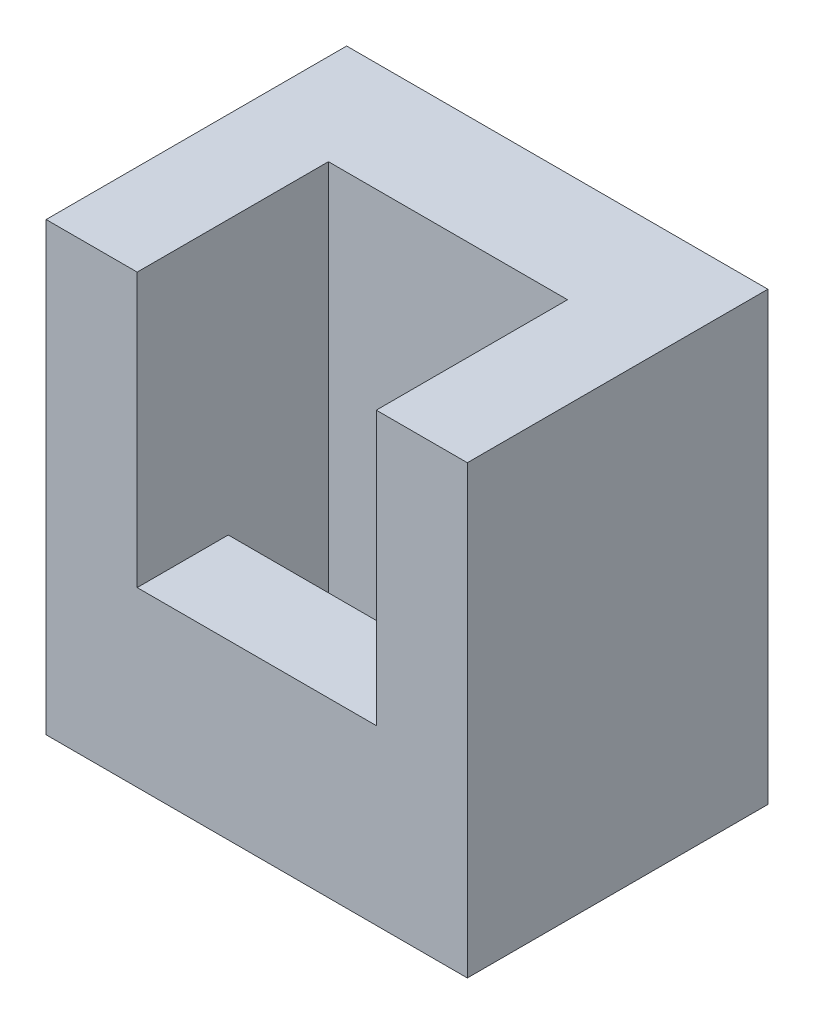
ISO-10303-21;
HEADER;
FILE_DESCRIPTION(('STEP AP214'),'2;1');
FILE_NAME('part.step','',(''),(''),'','','');
FILE_SCHEMA(('AUTOMOTIVE_DESIGN { 1 0 10303 214 1 1 1 1 }'));
ENDSEC;
DATA;
#1=APPLICATION_CONTEXT('core data for automotive mechanical design processes');
#2=APPLICATION_PROTOCOL_DEFINITION('international standard','automotive_design',2000,#1);
#3=PRODUCT_CONTEXT('',#1,'mechanical');
#4=PRODUCT('Part','Part','',(#3));
#5=PRODUCT_RELATED_PRODUCT_CATEGORY('part','',(#4));
#6=PRODUCT_DEFINITION_FORMATION('','',#4);
#7=PRODUCT_DEFINITION_CONTEXT('part definition',#1,'design');
#8=PRODUCT_DEFINITION('design','',#6,#7);
#9=PRODUCT_DEFINITION_SHAPE('','',#8);
#10=(LENGTH_UNIT() NAMED_UNIT(*) SI_UNIT(.MILLI.,.METRE.));
#11=(NAMED_UNIT(*) PLANE_ANGLE_UNIT() SI_UNIT($,.RADIAN.));
#12=(NAMED_UNIT(*) SI_UNIT($,.STERADIAN.) SOLID_ANGLE_UNIT());
#13=UNCERTAINTY_MEASURE_WITH_UNIT(LENGTH_MEASURE(1.E-05),#10,'distance_accuracy_value','');
#14=(GEOMETRIC_REPRESENTATION_CONTEXT(3) GLOBAL_UNCERTAINTY_ASSIGNED_CONTEXT((#13)) GLOBAL_UNIT_ASSIGNED_CONTEXT((#10,
#11,#12)) REPRESENTATION_CONTEXT('',''));
#15=CARTESIAN_POINT('',(0.,0.,0.));
#16=DIRECTION('',(0.,0.,1.));
#17=DIRECTION('',(1.,0.,0.));
#18=AXIS2_PLACEMENT_3D('',#15,#16,#17);
#19=CARTESIAN_POINT('',(0.,24.5,6.14769595053503));
#20=DIRECTION('',(0.,0.,-1.));
#21=DIRECTION('',(-1.,0.,0.));
#22=AXIS2_PLACEMENT_3D('',#19,#20,#21);
#23=PLANE('',#22);
#24=DIRECTION('',(0.,-1.,0.));
#25=VECTOR('',#24,1.);
#26=CARTESIAN_POINT('',(-8.02597166077041,24.5,6.14769595053503));
#27=LINE('',#26,#25);
#28=CARTESIAN_POINT('',(-8.02597166077041,9.5,6.14769595053503));
#29=VERTEX_POINT('',#28);
#30=CARTESIAN_POINT('',(-8.02597166077041,0.,6.14769595053503));
#31=VERTEX_POINT('',#30);
#32=EDGE_CURVE('E333',#29,#31,#27,.T.);
#33=ORIENTED_EDGE('',*,*,#32,.F.);
#34=DIRECTION('',(-1.,0.,0.));
#35=VECTOR('',#34,1.);
#36=CARTESIAN_POINT('',(-8.02597166077041,9.5,6.14769595053503));
#37=LINE('',#36,#35);
#38=CARTESIAN_POINT('',(5.10102833922959,9.5,6.14769595053503));
#39=VERTEX_POINT('',#38);
#40=EDGE_CURVE('E203',#39,#29,#37,.T.);
#41=ORIENTED_EDGE('',*,*,#40,.F.);
#42=DIRECTION('',(0.,-1.,0.));
#43=VECTOR('',#42,1.);
#44=CARTESIAN_POINT('',(5.10102833922959,24.5,6.14769595053503));
#45=LINE('',#44,#43);
#46=CARTESIAN_POINT('',(5.10102833922959,0.,6.14769595053503));
#47=VERTEX_POINT('',#46);
#48=EDGE_CURVE('E96',#39,#47,#45,.T.);
#49=ORIENTED_EDGE('',*,*,#48,.T.);
#50=DIRECTION('',(1.,0.,0.));
#51=VECTOR('',#50,1.);
#52=CARTESIAN_POINT('',(0.,0.,6.14769595053503));
#53=LINE('',#52,#51);
#54=EDGE_CURVE('E300',#31,#47,#53,.T.);
#55=ORIENTED_EDGE('',*,*,#54,.F.);
#56=EDGE_LOOP('',(#33,#41,#49,#55));
#57=FACE_BOUND('',#56,.T.);
#58=ADVANCED_FACE('F87',(#57),#23,.T.);
#59=CARTESIAN_POINT('',(5.10102833922959,24.5,0.));
#60=DIRECTION('',(1.,0.,0.));
#61=DIRECTION('',(0.,0.,-1.));
#62=AXIS2_PLACEMENT_3D('',#59,#60,#61);
#63=PLANE('',#62);
#64=DIRECTION('',(0.,0.,1.));
#65=VECTOR('',#64,1.);
#66=CARTESIAN_POINT('',(5.10102833922959,0.,0.));
#67=LINE('',#66,#65);
#68=CARTESIAN_POINT('',(5.10102833922959,0.,0.647695950535029));
#69=VERTEX_POINT('',#68);
#70=EDGE_CURVE('E252',#69,#47,#67,.T.);
#71=ORIENTED_EDGE('',*,*,#70,.T.);
#72=ORIENTED_EDGE('',*,*,#48,.F.);
#73=DIRECTION('',(0.,0.,-1.));
#74=VECTOR('',#73,1.);
#75=CARTESIAN_POINT('',(5.10102833922959,9.5,6.14769595053503));
#76=LINE('',#75,#74);
#77=CARTESIAN_POINT('',(5.1010283392296,9.5,11.147695950535));
#78=VERTEX_POINT('',#77);
#79=EDGE_CURVE('E217',#78,#39,#76,.T.);
#80=ORIENTED_EDGE('',*,*,#79,.F.);
#81=DIRECTION('',(0.,1.,0.));
#82=VECTOR('',#81,1.);
#83=CARTESIAN_POINT('',(5.1010283392296,9.5,11.147695950535));
#84=LINE('',#83,#82);
#85=CARTESIAN_POINT('',(5.1010283392296,24.5,11.147695950535));
#86=VERTEX_POINT('',#85);
#87=EDGE_CURVE('E202',#78,#86,#84,.T.);
#88=ORIENTED_EDGE('',*,*,#87,.T.);
#89=DIRECTION('',(0.,0.,1.));
#90=VECTOR('',#89,1.);
#91=CARTESIAN_POINT('',(5.10102833922959,24.5,0.));
#92=LINE('',#91,#90);
#93=CARTESIAN_POINT('',(5.10102833922959,24.5,0.647695950535029));
#94=VERTEX_POINT('',#93);
#95=EDGE_CURVE('E103',#94,#86,#92,.T.);
#96=ORIENTED_EDGE('',*,*,#95,.F.);
#97=DIRECTION('',(0.,-1.,0.));
#98=VECTOR('',#97,1.);
#99=CARTESIAN_POINT('',(5.10102833922959,24.5,0.647695950535029));
#100=LINE('',#99,#98);
#101=EDGE_CURVE('E12',#94,#69,#100,.T.);
#102=ORIENTED_EDGE('',*,*,#101,.T.);
#103=EDGE_LOOP('',(#71,#72,#80,#88,#96,#102));
#104=FACE_BOUND('',#103,.T.);
#105=ADVANCED_FACE('F89',(#104),#63,.F.);
#106=CARTESIAN_POINT('',(-8.02597166077041,24.5,0.));
#107=DIRECTION('',(1.,0.,0.));
#108=DIRECTION('',(0.,0.,-1.));
#109=AXIS2_PLACEMENT_3D('',#106,#107,#108);
#110=PLANE('',#109);
#111=DIRECTION('',(0.,0.,1.));
#112=VECTOR('',#111,1.);
#113=CARTESIAN_POINT('',(-8.02597166077041,0.,0.));
#114=LINE('',#113,#112);
#115=CARTESIAN_POINT('',(-8.02597166077041,0.,0.647695950535029));
#116=VERTEX_POINT('',#115);
#117=EDGE_CURVE('E304',#116,#31,#114,.T.);
#118=ORIENTED_EDGE('',*,*,#117,.F.);
#119=DIRECTION('',(0.,-1.,0.));
#120=VECTOR('',#119,1.);
#121=CARTESIAN_POINT('',(-8.02597166077041,24.5,0.647695950535029));
#122=LINE('',#121,#120);
#123=CARTESIAN_POINT('',(-8.02597166077041,24.5,0.647695950535029));
#124=VERTEX_POINT('',#123);
#125=EDGE_CURVE('E330',#124,#116,#122,.T.);
#126=ORIENTED_EDGE('',*,*,#125,.F.);
#127=DIRECTION('',(0.,0.,1.));
#128=VECTOR('',#127,1.);
#129=CARTESIAN_POINT('',(-8.02597166077041,24.5,0.));
#130=LINE('',#129,#128);
#131=CARTESIAN_POINT('',(-8.02597166077041,24.5,11.147695950535));
#132=VERTEX_POINT('',#131);
#133=EDGE_CURVE('E196',#124,#132,#130,.T.);
#134=ORIENTED_EDGE('',*,*,#133,.T.);
#135=DIRECTION('',(0.,1.,0.));
#136=VECTOR('',#135,1.);
#137=CARTESIAN_POINT('',(-8.02597166077041,9.5,11.147695950535));
#138=LINE('',#137,#136);
#139=CARTESIAN_POINT('',(-8.02597166077041,9.5,11.147695950535));
#140=VERTEX_POINT('',#139);
#141=EDGE_CURVE('E188',#140,#132,#138,.T.);
#142=ORIENTED_EDGE('',*,*,#141,.F.);
#143=DIRECTION('',(0.,0.,1.));
#144=VECTOR('',#143,1.);
#145=CARTESIAN_POINT('',(-8.02597166077041,9.5,6.14769595053503));
#146=LINE('',#145,#144);
#147=EDGE_CURVE('E192',#29,#140,#146,.T.);
#148=ORIENTED_EDGE('',*,*,#147,.F.);
#149=ORIENTED_EDGE('',*,*,#32,.T.);
#150=EDGE_LOOP('',(#118,#126,#134,#142,#148,#149));
#151=FACE_BOUND('',#150,.T.);
#152=ADVANCED_FACE('F191',(#151),#110,.T.);
#153=CARTESIAN_POINT('',(0.,24.5,0.647695950535029));
#154=DIRECTION('',(0.,0.,-1.));
#155=DIRECTION('',(-1.,0.,0.));
#156=AXIS2_PLACEMENT_3D('',#153,#154,#155);
#157=PLANE('',#156);
#158=DIRECTION('',(1.,0.,0.));
#159=VECTOR('',#158,1.);
#160=CARTESIAN_POINT('',(0.,0.,0.647695950535029));
#161=LINE('',#160,#159);
#162=CARTESIAN_POINT('',(-2.73747166077041,0.,0.647695950535029));
#163=VERTEX_POINT('',#162);
#164=EDGE_CURVE('E292',#116,#163,#161,.T.);
#165=ORIENTED_EDGE('',*,*,#164,.T.);
#166=DIRECTION('',(0.,-1.,0.));
#167=VECTOR('',#166,1.);
#168=CARTESIAN_POINT('',(-2.73747166077041,2.,0.647695950535029));
#169=LINE('',#168,#167);
#170=CARTESIAN_POINT('',(-2.73747166077041,2.,0.647695950535029));
#171=VERTEX_POINT('',#170);
#172=EDGE_CURVE('E249',#171,#163,#169,.T.);
#173=ORIENTED_EDGE('',*,*,#172,.F.);
#174=DIRECTION('',(-1.,0.,0.));
#175=VECTOR('',#174,1.);
#176=CARTESIAN_POINT('',(-2.73747166077041,2.,0.647695950535029));
#177=LINE('',#176,#175);
#178=CARTESIAN_POINT('',(-0.187471660770406,2.,0.647695950535029));
#179=VERTEX_POINT('',#178);
#180=EDGE_CURVE('E240',#179,#171,#177,.T.);
#181=ORIENTED_EDGE('',*,*,#180,.F.);
#182=DIRECTION('',(0.,-1.,0.));
#183=VECTOR('',#182,1.);
#184=CARTESIAN_POINT('',(-0.187471660770406,2.,0.647695950535029));
#185=LINE('',#184,#183);
#186=CARTESIAN_POINT('',(-0.187471660770406,0.,0.647695950535029));
#187=VERTEX_POINT('',#186);
#188=EDGE_CURVE('E253',#179,#187,#185,.T.);
#189=ORIENTED_EDGE('',*,*,#188,.T.);
#190=EDGE_CURVE('E296',#187,#69,#161,.T.);
#191=ORIENTED_EDGE('',*,*,#190,.T.);
#192=ORIENTED_EDGE('',*,*,#101,.F.);
#193=DIRECTION('',(1.,0.,0.));
#194=VECTOR('',#193,1.);
#195=CARTESIAN_POINT('',(0.,24.5,0.647695950535029));
#196=LINE('',#195,#194);
#197=EDGE_CURVE('E266',#124,#94,#196,.T.);
#198=ORIENTED_EDGE('',*,*,#197,.F.);
#199=ORIENTED_EDGE('',*,*,#125,.T.);
#200=EDGE_LOOP('',(#165,#173,#181,#189,#191,#192,#198,#199));
#201=FACE_BOUND('',#200,.T.);
#202=ADVANCED_FACE('F364',(#201),#157,.F.);
#203=CARTESIAN_POINT('',(0.,24.5,-5.35230404946497));
#204=DIRECTION('',(0.,0.,-1.));
#205=DIRECTION('',(-1.,0.,0.));
#206=AXIS2_PLACEMENT_3D('',#203,#204,#205);
#207=PLANE('',#206);
#208=DIRECTION('',(0.,-1.,0.));
#209=VECTOR('',#208,1.);
#210=CARTESIAN_POINT('',(-2.73747166077041,2.,-5.35230404946497));
#211=LINE('',#210,#209);
#212=CARTESIAN_POINT('',(-2.73747166077041,2.,-5.35230404946497));
#213=VERTEX_POINT('',#212);
#214=CARTESIAN_POINT('',(-2.73747166077041,0.,-5.35230404946497));
#215=VERTEX_POINT('',#214);
#216=EDGE_CURVE('E244',#213,#215,#211,.T.);
#217=ORIENTED_EDGE('',*,*,#216,.T.);
#218=DIRECTION('',(1.,0.,0.));
#219=VECTOR('',#218,1.);
#220=CARTESIAN_POINT('',(0.,0.,-5.35230404946497));
#221=LINE('',#220,#219);
#222=CARTESIAN_POINT('',(-13.0259716607704,0.,-5.35230404946497));
#223=VERTEX_POINT('',#222);
#224=EDGE_CURVE('E286',#223,#215,#221,.T.);
#225=ORIENTED_EDGE('',*,*,#224,.F.);
#226=DIRECTION('',(0.,-1.,0.));
#227=VECTOR('',#226,1.);
#228=CARTESIAN_POINT('',(-13.0259716607704,24.5,-5.35230404946497));
#229=LINE('',#228,#227);
#230=CARTESIAN_POINT('',(-13.0259716607704,24.5,-5.35230404946497));
#231=VERTEX_POINT('',#230);
#232=EDGE_CURVE('E327',#231,#223,#229,.T.);
#233=ORIENTED_EDGE('',*,*,#232,.F.);
#234=DIRECTION('',(1.,0.,0.));
#235=VECTOR('',#234,1.);
#236=CARTESIAN_POINT('',(0.,24.5,-5.35230404946497));
#237=LINE('',#236,#235);
#238=CARTESIAN_POINT('',(10.1010283392296,24.5,-5.35230404946497));
#239=VERTEX_POINT('',#238);
#240=EDGE_CURVE('E262',#231,#239,#237,.T.);
#241=ORIENTED_EDGE('',*,*,#240,.T.);
#242=DIRECTION('',(0.,-1.,0.));
#243=VECTOR('',#242,1.);
#244=CARTESIAN_POINT('',(10.1010283392296,24.5,-5.35230404946497));
#245=LINE('',#244,#243);
#246=CARTESIAN_POINT('',(10.1010283392296,0.,-5.35230404946497));
#247=VERTEX_POINT('',#246);
#248=EDGE_CURVE('E285',#239,#247,#245,.T.);
#249=ORIENTED_EDGE('',*,*,#248,.T.);
#250=CARTESIAN_POINT('',(-0.187471660770406,0.,-5.35230404946497));
#251=VERTEX_POINT('',#250);
#252=EDGE_CURVE('E291',#251,#247,#221,.T.);
#253=ORIENTED_EDGE('',*,*,#252,.F.);
#254=DIRECTION('',(0.,-1.,0.));
#255=VECTOR('',#254,1.);
#256=CARTESIAN_POINT('',(-0.187471660770406,2.,-5.35230404946497));
#257=LINE('',#256,#255);
#258=CARTESIAN_POINT('',(-0.187471660770406,2.,-5.35230404946497));
#259=VERTEX_POINT('',#258);
#260=EDGE_CURVE('E111',#259,#251,#257,.T.);
#261=ORIENTED_EDGE('',*,*,#260,.F.);
#262=DIRECTION('',(1.,0.,0.));
#263=VECTOR('',#262,1.);
#264=CARTESIAN_POINT('',(-2.73747166077041,2.,-5.35230404946497));
#265=LINE('',#264,#263);
#266=EDGE_CURVE('E231',#213,#259,#265,.T.);
#267=ORIENTED_EDGE('',*,*,#266,.F.);
#268=EDGE_LOOP('',(#217,#225,#233,#241,#249,#253,#261,#267));
#269=FACE_BOUND('',#268,.T.);
#270=ADVANCED_FACE('F367',(#269),#207,.T.);
#271=CARTESIAN_POINT('',(-13.0259716607704,24.5,0.));
#272=DIRECTION('',(1.,0.,0.));
#273=DIRECTION('',(0.,0.,-1.));
#274=AXIS2_PLACEMENT_3D('',#271,#272,#273);
#275=PLANE('',#274);
#276=DIRECTION('',(0.,0.,1.));
#277=VECTOR('',#276,1.);
#278=CARTESIAN_POINT('',(-13.0259716607704,0.,0.));
#279=LINE('',#278,#277);
#280=CARTESIAN_POINT('',(-13.0259716607704,0.,11.147695950535));
#281=VERTEX_POINT('',#280);
#282=EDGE_CURVE('E290',#223,#281,#279,.T.);
#283=ORIENTED_EDGE('',*,*,#282,.T.);
#284=DIRECTION('',(0.,-1.,0.));
#285=VECTOR('',#284,1.);
#286=CARTESIAN_POINT('',(-13.0259716607704,24.5,11.147695950535));
#287=LINE('',#286,#285);
#288=CARTESIAN_POINT('',(-13.0259716607704,24.5,11.147695950535));
#289=VERTEX_POINT('',#288);
#290=EDGE_CURVE('E323',#289,#281,#287,.T.);
#291=ORIENTED_EDGE('',*,*,#290,.F.);
#292=DIRECTION('',(0.,0.,1.));
#293=VECTOR('',#292,1.);
#294=CARTESIAN_POINT('',(-13.0259716607704,24.5,0.));
#295=LINE('',#294,#293);
#296=EDGE_CURVE('E274',#231,#289,#295,.T.);
#297=ORIENTED_EDGE('',*,*,#296,.F.);
#298=ORIENTED_EDGE('',*,*,#232,.T.);
#299=EDGE_LOOP('',(#283,#291,#297,#298));
#300=FACE_BOUND('',#299,.T.);
#301=ADVANCED_FACE('F370',(#300),#275,.F.);
#302=CARTESIAN_POINT('',(0.,24.5,11.147695950535));
#303=DIRECTION('',(0.,0.,-1.));
#304=DIRECTION('',(-1.,0.,0.));
#305=AXIS2_PLACEMENT_3D('',#302,#303,#304);
#306=PLANE('',#305);
#307=DIRECTION('',(1.,0.,0.));
#308=VECTOR('',#307,1.);
#309=CARTESIAN_POINT('',(-8.02597166077041,9.5,11.147695950535));
#310=LINE('',#309,#308);
#311=EDGE_CURVE('E208',#140,#78,#310,.T.);
#312=ORIENTED_EDGE('',*,*,#311,.F.);
#313=ORIENTED_EDGE('',*,*,#141,.T.);
#314=DIRECTION('',(1.,0.,0.));
#315=VECTOR('',#314,1.);
#316=CARTESIAN_POINT('',(0.,24.5,11.147695950535));
#317=LINE('',#316,#315);
#318=EDGE_CURVE('E278',#289,#132,#317,.T.);
#319=ORIENTED_EDGE('',*,*,#318,.F.);
#320=ORIENTED_EDGE('',*,*,#290,.T.);
#321=DIRECTION('',(1.,0.,0.));
#322=VECTOR('',#321,1.);
#323=CARTESIAN_POINT('',(0.,0.,11.147695950535));
#324=LINE('',#323,#322);
#325=CARTESIAN_POINT('',(10.1010283392296,0.,11.147695950535));
#326=VERTEX_POINT('',#325);
#327=EDGE_CURVE('E310',#281,#326,#324,.T.);
#328=ORIENTED_EDGE('',*,*,#327,.T.);
#329=DIRECTION('',(0.,-1.,0.));
#330=VECTOR('',#329,1.);
#331=CARTESIAN_POINT('',(10.1010283392296,24.5,11.147695950535));
#332=LINE('',#331,#330);
#333=CARTESIAN_POINT('',(10.1010283392296,24.5,11.147695950535));
#334=VERTEX_POINT('',#333);
#335=EDGE_CURVE('E320',#334,#326,#332,.T.);
#336=ORIENTED_EDGE('',*,*,#335,.F.);
#337=EDGE_CURVE('E277',#86,#334,#317,.T.);
#338=ORIENTED_EDGE('',*,*,#337,.F.);
#339=ORIENTED_EDGE('',*,*,#87,.F.);
#340=EDGE_LOOP('',(#312,#313,#319,#320,#328,#336,#338,#339));
#341=FACE_BOUND('',#340,.T.);
#342=ADVANCED_FACE('F214',(#341),#306,.F.);
#343=CARTESIAN_POINT('',(10.1010283392296,24.5,0.));
#344=DIRECTION('',(1.,0.,0.));
#345=DIRECTION('',(0.,0.,-1.));
#346=AXIS2_PLACEMENT_3D('',#343,#344,#345);
#347=PLANE('',#346);
#348=DIRECTION('',(0.,0.,1.));
#349=VECTOR('',#348,1.);
#350=CARTESIAN_POINT('',(10.1010283392296,0.,0.));
#351=LINE('',#350,#349);
#352=EDGE_CURVE('E267',#247,#326,#351,.T.);
#353=ORIENTED_EDGE('',*,*,#352,.F.);
#354=ORIENTED_EDGE('',*,*,#248,.F.);
#355=DIRECTION('',(0.,0.,1.));
#356=VECTOR('',#355,1.);
#357=CARTESIAN_POINT('',(10.1010283392296,24.5,0.));
#358=LINE('',#357,#356);
#359=EDGE_CURVE('E281',#239,#334,#358,.T.);
#360=ORIENTED_EDGE('',*,*,#359,.T.);
#361=ORIENTED_EDGE('',*,*,#335,.T.);
#362=EDGE_LOOP('',(#353,#354,#360,#361));
#363=FACE_BOUND('',#362,.T.);
#364=ADVANCED_FACE('F359',(#363),#347,.T.);
#365=CARTESIAN_POINT('',(0.,0.,0.));
#366=DIRECTION('',(0.,1.,0.));
#367=DIRECTION('',(0.,0.,1.));
#368=AXIS2_PLACEMENT_3D('',#365,#366,#367);
#369=PLANE('',#368);
#370=ORIENTED_EDGE('',*,*,#224,.T.);
#371=DIRECTION('',(0.,0.,-1.));
#372=VECTOR('',#371,1.);
#373=CARTESIAN_POINT('',(-2.73747166077041,0.,0.647695950535029));
#374=LINE('',#373,#372);
#375=EDGE_CURVE('E225',#163,#215,#374,.T.);
#376=ORIENTED_EDGE('',*,*,#375,.F.);
#377=ORIENTED_EDGE('',*,*,#164,.F.);
#378=ORIENTED_EDGE('',*,*,#117,.T.);
#379=ORIENTED_EDGE('',*,*,#54,.T.);
#380=ORIENTED_EDGE('',*,*,#70,.F.);
#381=ORIENTED_EDGE('',*,*,#190,.F.);
#382=DIRECTION('',(0.,0.,1.));
#383=VECTOR('',#382,1.);
#384=CARTESIAN_POINT('',(-0.187471660770406,0.,0.647695950535029));
#385=LINE('',#384,#383);
#386=EDGE_CURVE('E232',#251,#187,#385,.T.);
#387=ORIENTED_EDGE('',*,*,#386,.F.);
#388=ORIENTED_EDGE('',*,*,#252,.T.);
#389=ORIENTED_EDGE('',*,*,#352,.T.);
#390=ORIENTED_EDGE('',*,*,#327,.F.);
#391=ORIENTED_EDGE('',*,*,#282,.F.);
#392=EDGE_LOOP('',(#370,#376,#377,#378,#379,#380,#381,#387,#388,#389,#390,#391));
#393=FACE_BOUND('',#392,.T.);
#394=ADVANCED_FACE('F344',(#393),#369,.F.);
#395=CARTESIAN_POINT('',(0.,24.5,0.));
#396=DIRECTION('',(0.,1.,0.));
#397=DIRECTION('',(0.,0.,1.));
#398=AXIS2_PLACEMENT_3D('',#395,#396,#397);
#399=PLANE('',#398);
#400=ORIENTED_EDGE('',*,*,#318,.T.);
#401=ORIENTED_EDGE('',*,*,#133,.F.);
#402=ORIENTED_EDGE('',*,*,#197,.T.);
#403=ORIENTED_EDGE('',*,*,#95,.T.);
#404=ORIENTED_EDGE('',*,*,#337,.T.);
#405=ORIENTED_EDGE('',*,*,#359,.F.);
#406=ORIENTED_EDGE('',*,*,#240,.F.);
#407=ORIENTED_EDGE('',*,*,#296,.T.);
#408=EDGE_LOOP('',(#400,#401,#402,#403,#404,#405,#406,#407));
#409=FACE_BOUND('',#408,.T.);
#410=ADVANCED_FACE('F348',(#409),#399,.T.);
#411=CARTESIAN_POINT('',(-2.73747166077041,2.,0.647695950535029));
#412=DIRECTION('',(-1.,0.,0.));
#413=DIRECTION('',(0.,0.,1.));
#414=AXIS2_PLACEMENT_3D('',#411,#412,#413);
#415=PLANE('',#414);
#416=ORIENTED_EDGE('',*,*,#375,.T.);
#417=ORIENTED_EDGE('',*,*,#216,.F.);
#418=DIRECTION('',(0.,0.,-1.));
#419=VECTOR('',#418,1.);
#420=CARTESIAN_POINT('',(-2.73747166077041,2.,0.647695950535029));
#421=LINE('',#420,#419);
#422=EDGE_CURVE('E227',#171,#213,#421,.T.);
#423=ORIENTED_EDGE('',*,*,#422,.F.);
#424=ORIENTED_EDGE('',*,*,#172,.T.);
#425=EDGE_LOOP('',(#416,#417,#423,#424));
#426=FACE_BOUND('',#425,.T.);
#427=ADVANCED_FACE('F415',(#426),#415,.F.);
#428=CARTESIAN_POINT('',(-0.187471660770406,2.,0.647695950535029));
#429=DIRECTION('',(1.,0.,0.));
#430=DIRECTION('',(0.,0.,-1.));
#431=AXIS2_PLACEMENT_3D('',#428,#429,#430);
#432=PLANE('',#431);
#433=ORIENTED_EDGE('',*,*,#386,.T.);
#434=ORIENTED_EDGE('',*,*,#188,.F.);
#435=DIRECTION('',(0.,0.,1.));
#436=VECTOR('',#435,1.);
#437=CARTESIAN_POINT('',(-0.187471660770406,2.,0.647695950535029));
#438=LINE('',#437,#436);
#439=EDGE_CURVE('E236',#259,#179,#438,.T.);
#440=ORIENTED_EDGE('',*,*,#439,.F.);
#441=ORIENTED_EDGE('',*,*,#260,.T.);
#442=EDGE_LOOP('',(#433,#434,#440,#441));
#443=FACE_BOUND('',#442,.T.);
#444=ADVANCED_FACE('F420',(#443),#432,.F.);
#445=CARTESIAN_POINT('',(0.,2.,0.));
#446=DIRECTION('',(0.,-1.,0.));
#447=DIRECTION('',(0.,0.,-1.));
#448=AXIS2_PLACEMENT_3D('',#445,#446,#447);
#449=PLANE('',#448);
#450=ORIENTED_EDGE('',*,*,#422,.T.);
#451=ORIENTED_EDGE('',*,*,#266,.T.);
#452=ORIENTED_EDGE('',*,*,#439,.T.);
#453=ORIENTED_EDGE('',*,*,#180,.T.);
#454=EDGE_LOOP('',(#450,#451,#452,#453));
#455=FACE_BOUND('',#454,.T.);
#456=ADVANCED_FACE('F430',(#455),#449,.T.);
#457=CARTESIAN_POINT('',(0.,9.5,0.));
#458=DIRECTION('',(0.,1.,0.));
#459=DIRECTION('',(0.,0.,1.));
#460=AXIS2_PLACEMENT_3D('',#457,#458,#459);
#461=PLANE('',#460);
#462=ORIENTED_EDGE('',*,*,#147,.T.);
#463=ORIENTED_EDGE('',*,*,#311,.T.);
#464=ORIENTED_EDGE('',*,*,#79,.T.);
#465=ORIENTED_EDGE('',*,*,#40,.T.);
#466=EDGE_LOOP('',(#462,#463,#464,#465));
#467=FACE_BOUND('',#466,.T.);
#468=ADVANCED_FACE('F207',(#467),#461,.T.);
#469=CLOSED_SHELL('',(#58,#105,#152,#202,#270,#301,#342,#364,#394,#410,#427,#444,#456,#468));
#470=MANIFOLD_SOLID_BREP('B2',#469);
#471=ADVANCED_BREP_SHAPE_REPRESENTATION('',(#18,#470),#14);
#472=SHAPE_DEFINITION_REPRESENTATION(#9,#471);
ENDSEC;
END-ISO-10303-21;
